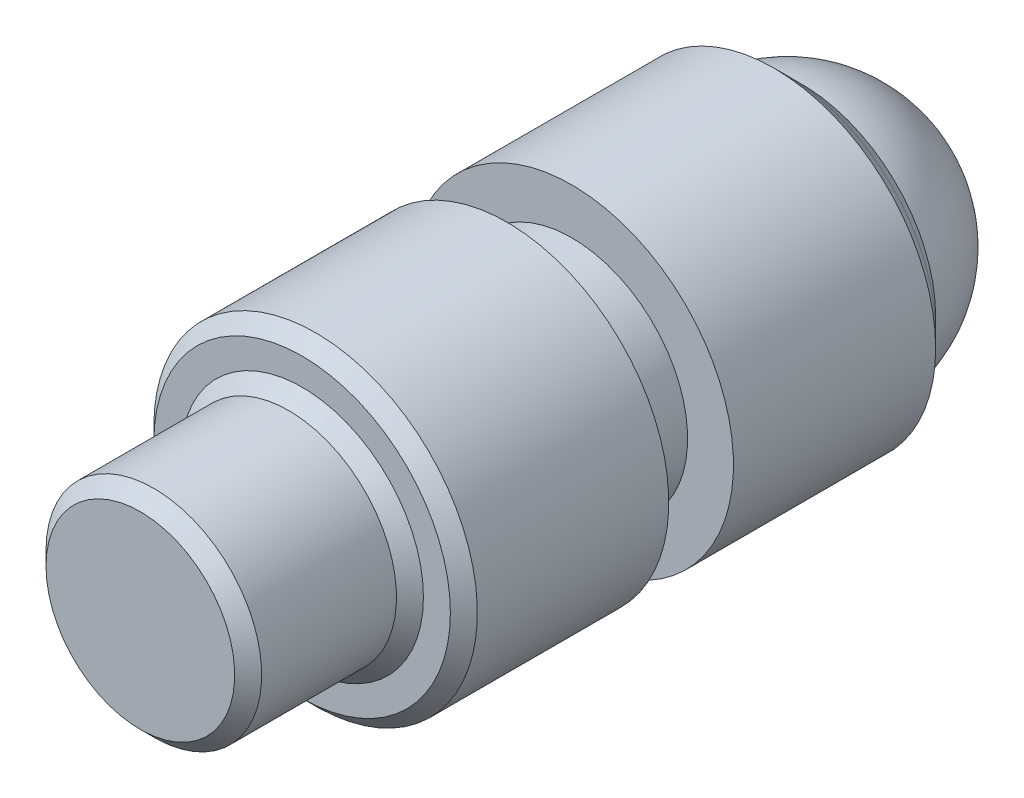
ISO-10303-21;
HEADER;
FILE_DESCRIPTION(('STEP AP214'),'2;1');
FILE_NAME('part.step','',(''),(''),'','','');
FILE_SCHEMA(('AUTOMOTIVE_DESIGN { 1 0 10303 214 1 1 1 1 }'));
ENDSEC;
DATA;
#1=APPLICATION_CONTEXT('core data for automotive mechanical design processes');
#2=APPLICATION_PROTOCOL_DEFINITION('international standard','automotive_design',2000,#1);
#3=PRODUCT_CONTEXT('',#1,'mechanical');
#4=PRODUCT('Part','Part','',(#3));
#5=PRODUCT_RELATED_PRODUCT_CATEGORY('part','',(#4));
#6=PRODUCT_DEFINITION_FORMATION('','',#4);
#7=PRODUCT_DEFINITION_CONTEXT('part definition',#1,'design');
#8=PRODUCT_DEFINITION('design','',#6,#7);
#9=PRODUCT_DEFINITION_SHAPE('','',#8);
#10=(LENGTH_UNIT() NAMED_UNIT(*) SI_UNIT(.MILLI.,.METRE.));
#11=(NAMED_UNIT(*) PLANE_ANGLE_UNIT() SI_UNIT($,.RADIAN.));
#12=(NAMED_UNIT(*) SI_UNIT($,.STERADIAN.) SOLID_ANGLE_UNIT());
#13=UNCERTAINTY_MEASURE_WITH_UNIT(LENGTH_MEASURE(1.E-05),#10,'distance_accuracy_value','');
#14=(GEOMETRIC_REPRESENTATION_CONTEXT(3) GLOBAL_UNCERTAINTY_ASSIGNED_CONTEXT((#13)) GLOBAL_UNIT_ASSIGNED_CONTEXT((#10,
#11,#12)) REPRESENTATION_CONTEXT('',''));
#15=CARTESIAN_POINT('',(0.,0.,0.));
#16=DIRECTION('',(0.,0.,1.));
#17=DIRECTION('',(1.,0.,0.));
#18=AXIS2_PLACEMENT_3D('',#15,#16,#17);
#19=CARTESIAN_POINT('',(0.000115765330759021,0.,0.000115765330758587));
#20=DIRECTION('',(0.,-1.,0.));
#21=DIRECTION('',(-1.,0.,0.));
#22=AXIS2_PLACEMENT_3D('',#19,#20,#21);
#23=CIRCLE('',#22,5.00011576667089);
#24=TRIMMED_CURVE('',#23,(PARAMETER_VALUE(-1.5707731742648)),(PARAMETER_VALUE(1.5707731742648)),
.T.,.PARAMETER.);
#25=CARTESIAN_POINT('',(0.,0.,0.000115765330758587));
#26=DIRECTION('',(0.,0.,-1.));
#27=AXIS1_PLACEMENT('',#25,#26);
#28=SURFACE_OF_REVOLUTION('',#24,#27);
#29=CARTESIAN_POINT('',(0.,0.,-0.527964420326571));
#30=DIRECTION('',(0.,0.,1.));
#31=DIRECTION('',(1.,0.,0.));
#32=AXIS2_PLACEMENT_3D('',#29,#30,#31);
#33=CIRCLE('',#32,4.97203557967343);
#34=CARTESIAN_POINT('',(4.97203557967343,0.,-0.527964420326571));
#35=VERTEX_POINT('',#34);
#36=EDGE_CURVE('E52',#35,#35,#33,.F.);
#37=ORIENTED_EDGE('',*,*,#36,.T.);
#38=EDGE_LOOP('',(#37));
#39=FACE_BOUND('',#38,.T.);
#40=CARTESIAN_POINT('',(0.,0.,-5.));
#41=VERTEX_POINT('',#40);
#42=VERTEX_LOOP('',#41);
#43=FACE_BOUND('',#42,.T.);
#44=ADVANCED_FACE('F43',(#39,#43),#28,.T.);
#45=CARTESIAN_POINT('',(0.,0.,24.));
#46=DIRECTION('',(0.,0.,-1.));
#47=DIRECTION('',(-1.,0.,0.));
#48=AXIS2_PLACEMENT_3D('',#45,#46,#47);
#49=PLANE('',#48);
#50=CARTESIAN_POINT('',(0.,0.,24.));
#51=DIRECTION('',(0.,0.,-1.));
#52=DIRECTION('',(-1.,0.,0.));
#53=AXIS2_PLACEMENT_3D('',#50,#51,#52);
#54=CIRCLE('',#53,3.5);
#55=CARTESIAN_POINT('',(-3.5,0.,24.));
#56=VERTEX_POINT('',#55);
#57=EDGE_CURVE('E11',#56,#56,#54,.F.);
#58=ORIENTED_EDGE('',*,*,#57,.T.);
#59=EDGE_LOOP('',(#58));
#60=FACE_BOUND('',#59,.T.);
#61=ADVANCED_FACE('F56',(#60),#49,.F.);
#62=CARTESIAN_POINT('',(0.,0.,0.));
#63=DIRECTION('',(0.,0.,-1.));
#64=DIRECTION('',(-1.,0.,0.));
#65=AXIS2_PLACEMENT_3D('',#62,#63,#64);
#66=CYLINDRICAL_SURFACE('',#65,4.);
#67=CARTESIAN_POINT('',(0.,0.,18.5));
#68=DIRECTION('',(0.,0.,-1.));
#69=DIRECTION('',(-1.,0.,0.));
#70=AXIS2_PLACEMENT_3D('',#67,#68,#69);
#71=CIRCLE('',#70,4.);
#72=CARTESIAN_POINT('',(-4.,0.,18.5));
#73=VERTEX_POINT('',#72);
#74=EDGE_CURVE('E127',#73,#73,#71,.F.);
#75=ORIENTED_EDGE('',*,*,#74,.T.);
#76=EDGE_LOOP('',(#75));
#77=FACE_BOUND('',#76,.T.);
#78=CARTESIAN_POINT('',(0.,0.,23.5));
#79=DIRECTION('',(0.,0.,-1.));
#80=DIRECTION('',(-1.,0.,0.));
#81=AXIS2_PLACEMENT_3D('',#78,#79,#80);
#82=CIRCLE('',#81,4.);
#83=CARTESIAN_POINT('',(-4.,0.,23.5));
#84=VERTEX_POINT('',#83);
#85=EDGE_CURVE('E124',#84,#84,#82,.T.);
#86=ORIENTED_EDGE('',*,*,#85,.T.);
#87=EDGE_LOOP('',(#86));
#88=FACE_BOUND('',#87,.T.);
#89=ADVANCED_FACE('F63',(#77,#88),#66,.T.);
#90=CARTESIAN_POINT('',(4.,0.,18.));
#91=DIRECTION('',(0.,0.,-1.));
#92=DIRECTION('',(-1.,0.,0.));
#93=AXIS2_PLACEMENT_3D('',#90,#91,#92);
#94=PLANE('',#93);
#95=CARTESIAN_POINT('',(0.,0.,18.));
#96=DIRECTION('',(0.,0.,-1.));
#97=DIRECTION('',(-1.,0.,0.));
#98=AXIS2_PLACEMENT_3D('',#95,#96,#97);
#99=CIRCLE('',#98,4.5);
#100=CARTESIAN_POINT('',(-4.5,0.,18.));
#101=VERTEX_POINT('',#100);
#102=EDGE_CURVE('E121',#101,#101,#99,.T.);
#103=ORIENTED_EDGE('',*,*,#102,.T.);
#104=EDGE_LOOP('',(#103));
#105=FACE_BOUND('',#104,.T.);
#106=CARTESIAN_POINT('',(0.,0.,18.));
#107=DIRECTION('',(0.,0.,-1.));
#108=DIRECTION('',(-1.,0.,0.));
#109=AXIS2_PLACEMENT_3D('',#106,#107,#108);
#110=CIRCLE('',#109,5.5);
#111=CARTESIAN_POINT('',(-5.5,0.,18.));
#112=VERTEX_POINT('',#111);
#113=EDGE_CURVE('E118',#112,#112,#110,.F.);
#114=ORIENTED_EDGE('',*,*,#113,.T.);
#115=EDGE_LOOP('',(#114));
#116=FACE_BOUND('',#115,.T.);
#117=ADVANCED_FACE('F157',(#105,#116),#94,.F.);
#118=CARTESIAN_POINT('',(0.,0.,0.));
#119=DIRECTION('',(0.,0.,-1.));
#120=DIRECTION('',(-1.,0.,0.));
#121=AXIS2_PLACEMENT_3D('',#118,#119,#120);
#122=CYLINDRICAL_SURFACE('',#121,6.);
#123=CARTESIAN_POINT('',(0.,0.,17.5));
#124=DIRECTION('',(0.,0.,-1.));
#125=DIRECTION('',(-1.,0.,0.));
#126=AXIS2_PLACEMENT_3D('',#123,#124,#125);
#127=CIRCLE('',#126,6.);
#128=CARTESIAN_POINT('',(-6.,0.,17.5));
#129=VERTEX_POINT('',#128);
#130=EDGE_CURVE('E130',#129,#129,#127,.T.);
#131=ORIENTED_EDGE('',*,*,#130,.T.);
#132=EDGE_LOOP('',(#131));
#133=FACE_BOUND('',#132,.T.);
#134=CARTESIAN_POINT('',(0.,0.,10.4));
#135=DIRECTION('',(0.,0.,-1.));
#136=DIRECTION('',(-1.,0.,0.));
#137=AXIS2_PLACEMENT_3D('',#134,#135,#136);
#138=CIRCLE('',#137,6.);
#139=CARTESIAN_POINT('',(-6.,0.,10.4));
#140=VERTEX_POINT('',#139);
#141=EDGE_CURVE('E115',#140,#140,#138,.T.);
#142=ORIENTED_EDGE('',*,*,#141,.F.);
#143=EDGE_LOOP('',(#142));
#144=FACE_BOUND('',#143,.T.);
#145=ADVANCED_FACE('F154',(#133,#144),#122,.T.);
#146=CARTESIAN_POINT('',(6.,0.,10.4));
#147=DIRECTION('',(0.,0.,1.));
#148=DIRECTION('',(1.,0.,0.));
#149=AXIS2_PLACEMENT_3D('',#146,#147,#148);
#150=PLANE('',#149);
#151=CARTESIAN_POINT('',(0.,0.,10.4));
#152=DIRECTION('',(0.,0.,-1.));
#153=DIRECTION('',(-1.,0.,0.));
#154=AXIS2_PLACEMENT_3D('',#151,#152,#153);
#155=CIRCLE('',#154,4.3);
#156=CARTESIAN_POINT('',(-4.3,0.,10.4));
#157=VERTEX_POINT('',#156);
#158=EDGE_CURVE('E110',#157,#157,#155,.T.);
#159=ORIENTED_EDGE('',*,*,#158,.F.);
#160=EDGE_LOOP('',(#159));
#161=FACE_BOUND('',#160,.T.);
#162=ORIENTED_EDGE('',*,*,#141,.T.);
#163=EDGE_LOOP('',(#162));
#164=FACE_BOUND('',#163,.T.);
#165=ADVANCED_FACE('F150',(#161,#164),#150,.F.);
#166=CARTESIAN_POINT('',(0.,0.,0.));
#167=DIRECTION('',(0.,0.,-1.));
#168=DIRECTION('',(-1.,0.,0.));
#169=AXIS2_PLACEMENT_3D('',#166,#167,#168);
#170=CYLINDRICAL_SURFACE('',#169,4.3);
#171=CARTESIAN_POINT('',(0.,0.,8.));
#172=DIRECTION('',(0.,0.,-1.));
#173=DIRECTION('',(-1.,0.,0.));
#174=AXIS2_PLACEMENT_3D('',#171,#172,#173);
#175=CIRCLE('',#174,4.3);
#176=CARTESIAN_POINT('',(-4.3,0.,8.));
#177=VERTEX_POINT('',#176);
#178=EDGE_CURVE('E105',#177,#177,#175,.T.);
#179=ORIENTED_EDGE('',*,*,#178,.F.);
#180=EDGE_LOOP('',(#179));
#181=FACE_BOUND('',#180,.T.);
#182=ORIENTED_EDGE('',*,*,#158,.T.);
#183=EDGE_LOOP('',(#182));
#184=FACE_BOUND('',#183,.T.);
#185=ADVANCED_FACE('F144',(#181,#184),#170,.T.);
#186=CARTESIAN_POINT('',(4.3,0.,8.));
#187=DIRECTION('',(0.,0.,-1.));
#188=DIRECTION('',(-1.,0.,0.));
#189=AXIS2_PLACEMENT_3D('',#186,#187,#188);
#190=PLANE('',#189);
#191=CARTESIAN_POINT('',(0.,0.,8.));
#192=DIRECTION('',(0.,0.,-1.));
#193=DIRECTION('',(-1.,0.,0.));
#194=AXIS2_PLACEMENT_3D('',#191,#192,#193);
#195=CIRCLE('',#194,6.);
#196=CARTESIAN_POINT('',(-6.,0.,8.));
#197=VERTEX_POINT('',#196);
#198=EDGE_CURVE('E103',#197,#197,#195,.T.);
#199=ORIENTED_EDGE('',*,*,#198,.F.);
#200=EDGE_LOOP('',(#199));
#201=FACE_BOUND('',#200,.T.);
#202=ORIENTED_EDGE('',*,*,#178,.T.);
#203=EDGE_LOOP('',(#202));
#204=FACE_BOUND('',#203,.T.);
#205=ADVANCED_FACE('F139',(#201,#204),#190,.F.);
#206=CARTESIAN_POINT('',(0.,0.,0.));
#207=DIRECTION('',(0.,0.,-1.));
#208=DIRECTION('',(-1.,0.,0.));
#209=AXIS2_PLACEMENT_3D('',#206,#207,#208);
#210=CYLINDRICAL_SURFACE('',#209,6.);
#211=CARTESIAN_POINT('',(0.,0.,0.500000000000002));
#212=DIRECTION('',(0.,0.,1.));
#213=DIRECTION('',(1.,0.,0.));
#214=AXIS2_PLACEMENT_3D('',#211,#212,#213);
#215=CIRCLE('',#214,6.);
#216=CARTESIAN_POINT('',(6.,0.,0.500000000000002));
#217=VERTEX_POINT('',#216);
#218=EDGE_CURVE('E133',#217,#217,#215,.T.);
#219=ORIENTED_EDGE('',*,*,#218,.T.);
#220=EDGE_LOOP('',(#219));
#221=FACE_BOUND('',#220,.T.);
#222=ORIENTED_EDGE('',*,*,#198,.T.);
#223=EDGE_LOOP('',(#222));
#224=FACE_BOUND('',#223,.T.);
#225=ADVANCED_FACE('F77',(#221,#224),#210,.T.);
#226=CARTESIAN_POINT('',(0.,0.,18.));
#227=DIRECTION('',(0.,0.,-1.));
#228=DIRECTION('',(-1.,0.,0.));
#229=AXIS2_PLACEMENT_3D('',#226,#227,#228);
#230=CONICAL_SURFACE('',#229,4.5,0.785398163397448);
#231=ORIENTED_EDGE('',*,*,#74,.F.);
#232=EDGE_LOOP('',(#231));
#233=FACE_BOUND('',#232,.T.);
#234=ORIENTED_EDGE('',*,*,#102,.F.);
#235=EDGE_LOOP('',(#234));
#236=FACE_BOUND('',#235,.T.);
#237=ADVANCED_FACE('F70',(#233,#236),#230,.T.);
#238=CARTESIAN_POINT('',(0.,0.,17.5));
#239=DIRECTION('',(0.,0.,-1.));
#240=DIRECTION('',(-1.,0.,0.));
#241=AXIS2_PLACEMENT_3D('',#238,#239,#240);
#242=CONICAL_SURFACE('',#241,6.,0.785398163397457);
#243=ORIENTED_EDGE('',*,*,#113,.F.);
#244=EDGE_LOOP('',(#243));
#245=FACE_BOUND('',#244,.T.);
#246=ORIENTED_EDGE('',*,*,#130,.F.);
#247=EDGE_LOOP('',(#246));
#248=FACE_BOUND('',#247,.T.);
#249=ADVANCED_FACE('F76',(#245,#248),#242,.T.);
#250=CARTESIAN_POINT('',(0.,0.,-0.527964420326571));
#251=DIRECTION('',(0.,0.,1.));
#252=DIRECTION('',(1.,0.,0.));
#253=AXIS2_PLACEMENT_3D('',#250,#251,#252);
#254=CONICAL_SURFACE('',#253,4.97203557967343,0.785398163397446);
#255=ORIENTED_EDGE('',*,*,#36,.F.);
#256=EDGE_LOOP('',(#255));
#257=FACE_BOUND('',#256,.T.);
#258=CARTESIAN_POINT('',(0.,0.,0.));
#259=DIRECTION('',(0.,0.,1.));
#260=DIRECTION('',(1.,0.,0.));
#261=AXIS2_PLACEMENT_3D('',#258,#259,#260);
#262=CIRCLE('',#261,5.5);
#263=CARTESIAN_POINT('',(5.5,0.,0.));
#264=VERTEX_POINT('',#263);
#265=EDGE_CURVE('E48',#264,#264,#262,.T.);
#266=ORIENTED_EDGE('',*,*,#265,.F.);
#267=EDGE_LOOP('',(#266));
#268=FACE_BOUND('',#267,.T.);
#269=ADVANCED_FACE('F84',(#257,#268),#254,.T.);
#270=CARTESIAN_POINT('',(0.,0.,0.));
#271=DIRECTION('',(0.,0.,1.));
#272=DIRECTION('',(1.,0.,0.));
#273=AXIS2_PLACEMENT_3D('',#270,#271,#272);
#274=CONICAL_SURFACE('',#273,5.5,0.785398163397445);
#275=ORIENTED_EDGE('',*,*,#218,.F.);
#276=EDGE_LOOP('',(#275));
#277=FACE_BOUND('',#276,.T.);
#278=ORIENTED_EDGE('',*,*,#265,.T.);
#279=EDGE_LOOP('',(#278));
#280=FACE_BOUND('',#279,.T.);
#281=ADVANCED_FACE('F87',(#277,#280),#274,.T.);
#282=CARTESIAN_POINT('',(0.,0.,23.5));
#283=DIRECTION('',(0.,0.,-1.));
#284=DIRECTION('',(-1.,0.,0.));
#285=AXIS2_PLACEMENT_3D('',#282,#283,#284);
#286=CONICAL_SURFACE('',#285,4.,0.785398163397455);
#287=ORIENTED_EDGE('',*,*,#57,.F.);
#288=EDGE_LOOP('',(#287));
#289=FACE_BOUND('',#288,.T.);
#290=ORIENTED_EDGE('',*,*,#85,.F.);
#291=EDGE_LOOP('',(#290));
#292=FACE_BOUND('',#291,.T.);
#293=ADVANCED_FACE('F46',(#289,#292),#286,.T.);
#294=CLOSED_SHELL('',(#44,#61,#89,#117,#145,#165,#185,#205,#225,#237,#249,#269,#281,#293));
#295=MANIFOLD_SOLID_BREP('B2',#294);
#296=ADVANCED_BREP_SHAPE_REPRESENTATION('',(#18,#295),#14);
#297=SHAPE_DEFINITION_REPRESENTATION(#9,#296);
ENDSEC;
END-ISO-10303-21;
